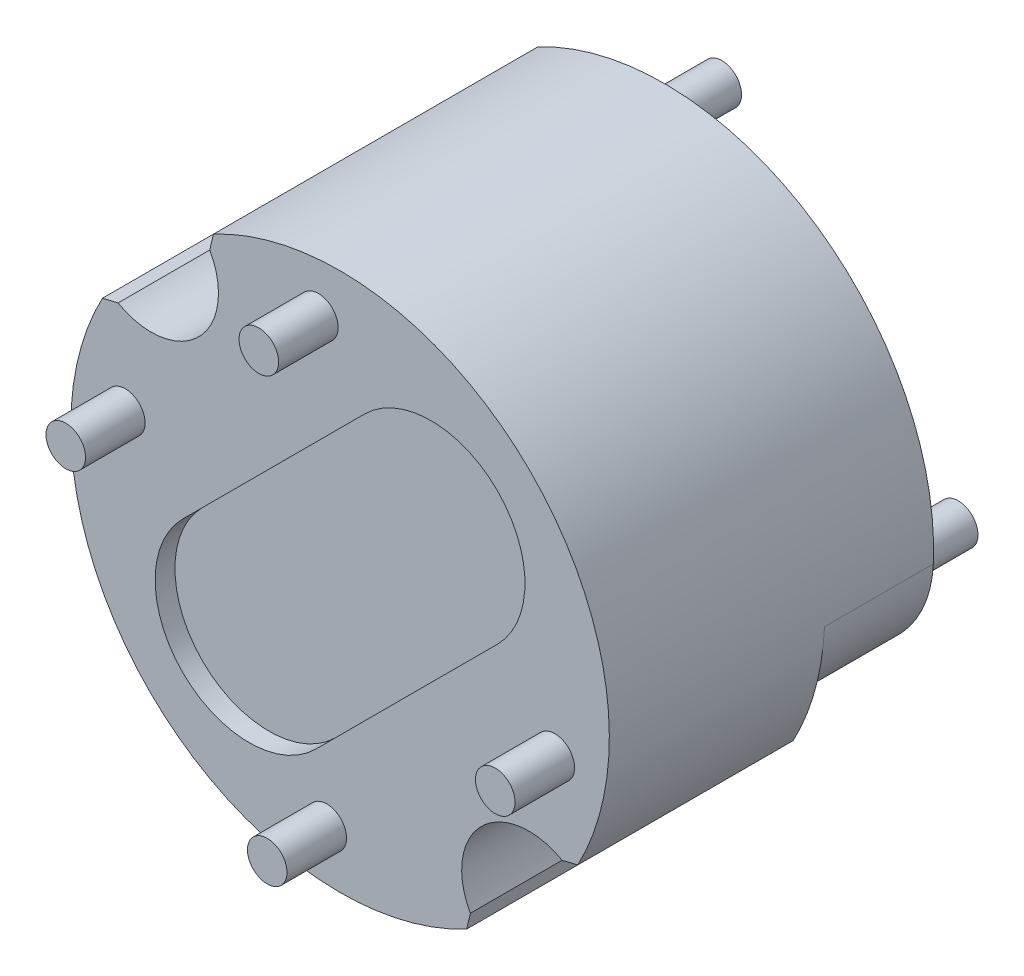
ISO-10303-21;
HEADER;
FILE_DESCRIPTION(('STEP AP214'),'2;1');
FILE_NAME('part.step','',(''),(''),'','','');
FILE_SCHEMA(('AUTOMOTIVE_DESIGN { 1 0 10303 214 1 1 1 1 }'));
ENDSEC;
DATA;
#1=APPLICATION_CONTEXT('core data for automotive mechanical design processes');
#2=APPLICATION_PROTOCOL_DEFINITION('international standard','automotive_design',2000,#1);
#3=PRODUCT_CONTEXT('',#1,'mechanical');
#4=PRODUCT('Part','Part','',(#3));
#5=PRODUCT_RELATED_PRODUCT_CATEGORY('part','',(#4));
#6=PRODUCT_DEFINITION_FORMATION('','',#4);
#7=PRODUCT_DEFINITION_CONTEXT('part definition',#1,'design');
#8=PRODUCT_DEFINITION('design','',#6,#7);
#9=PRODUCT_DEFINITION_SHAPE('','',#8);
#10=(LENGTH_UNIT() NAMED_UNIT(*) SI_UNIT(.MILLI.,.METRE.));
#11=(NAMED_UNIT(*) PLANE_ANGLE_UNIT() SI_UNIT($,.RADIAN.));
#12=(NAMED_UNIT(*) SI_UNIT($,.STERADIAN.) SOLID_ANGLE_UNIT());
#13=UNCERTAINTY_MEASURE_WITH_UNIT(LENGTH_MEASURE(1.E-05),#10,'distance_accuracy_value','');
#14=(GEOMETRIC_REPRESENTATION_CONTEXT(3) GLOBAL_UNCERTAINTY_ASSIGNED_CONTEXT((#13)) GLOBAL_UNIT_ASSIGNED_CONTEXT((#10,
#11,#12)) REPRESENTATION_CONTEXT('',''));
#15=CARTESIAN_POINT('',(0.,0.,0.));
#16=DIRECTION('',(0.,0.,1.));
#17=DIRECTION('',(1.,0.,0.));
#18=AXIS2_PLACEMENT_3D('',#15,#16,#17);
#19=CARTESIAN_POINT('',(10.8540890912135,-2.22738636073771,1245.3));
#20=DIRECTION('',(0.,0.,1.));
#21=DIRECTION('',(1.,0.,0.));
#22=AXIS2_PLACEMENT_3D('',#19,#20,#21);
#23=PLANE('',#22);
#24=CARTESIAN_POINT('',(10.8540890912135,-2.22738636073771,1245.3));
#25=DIRECTION('',(0.,0.,1.));
#26=DIRECTION('',(-0.70710678118655,-0.707106781186545,0.));
#27=AXIS2_PLACEMENT_3D('',#24,#25,#26);
#28=CIRCLE('',#27,1.);
#29=CARTESIAN_POINT('',(10.1469823100269,-2.93449314192425,1245.3));
#30=VERTEX_POINT('',#29);
#31=EDGE_CURVE('E10',#30,#30,#28,.T.);
#32=ORIENTED_EDGE('',*,*,#31,.F.);
#33=EDGE_LOOP('',(#32));
#34=FACE_BOUND('',#33,.T.);
#35=ADVANCED_FACE('F15',(#34),#23,.F.);
#36=CARTESIAN_POINT('',(10.8540890912135,-2.22738636073771,1245.3));
#37=DIRECTION('',(0.,0.,1.));
#38=DIRECTION('',(1.,0.,0.));
#39=AXIS2_PLACEMENT_3D('',#36,#37,#38);
#40=CYLINDRICAL_SURFACE('',#39,1.);
#41=CARTESIAN_POINT('',(10.8540890912135,-2.22738636073771,1249.3));
#42=DIRECTION('',(0.,0.,1.));
#43=DIRECTION('',(-0.70710678118655,-0.707106781186545,0.));
#44=AXIS2_PLACEMENT_3D('',#41,#42,#43);
#45=CIRCLE('',#44,1.);
#46=CARTESIAN_POINT('',(10.1469823100269,-2.93449314192425,1249.3));
#47=VERTEX_POINT('',#46);
#48=EDGE_CURVE('E435',#47,#47,#45,.T.);
#49=ORIENTED_EDGE('',*,*,#48,.F.);
#50=EDGE_LOOP('',(#49));
#51=FACE_BOUND('',#50,.T.);
#52=ORIENTED_EDGE('',*,*,#31,.T.);
#53=EDGE_LOOP('',(#52));
#54=FACE_BOUND('',#53,.T.);
#55=ADVANCED_FACE('F528',(#51,#54),#40,.T.);
#56=CARTESIAN_POINT('',(-1.0960155108391,11.0662211255695,1245.3));
#57=DIRECTION('',(0.,0.,1.));
#58=DIRECTION('',(1.,0.,0.));
#59=AXIS2_PLACEMENT_3D('',#56,#57,#58);
#60=PLANE('',#59);
#61=CARTESIAN_POINT('',(-1.0960155108391,11.0662211255695,1245.3));
#62=DIRECTION('',(0.,0.,1.));
#63=DIRECTION('',(-0.70710678118655,-0.707106781186545,0.));
#64=AXIS2_PLACEMENT_3D('',#61,#62,#63);
#65=CIRCLE('',#64,1.);
#66=CARTESIAN_POINT('',(-1.80312229202565,10.3591143443829,1245.3));
#67=VERTEX_POINT('',#66);
#68=EDGE_CURVE('E26',#67,#67,#65,.T.);
#69=ORIENTED_EDGE('',*,*,#68,.F.);
#70=EDGE_LOOP('',(#69));
#71=FACE_BOUND('',#70,.T.);
#72=ADVANCED_FACE('F535',(#71),#60,.F.);
#73=CARTESIAN_POINT('',(-1.0960155108391,11.0662211255695,1245.3));
#74=DIRECTION('',(0.,0.,1.));
#75=DIRECTION('',(1.,0.,0.));
#76=AXIS2_PLACEMENT_3D('',#73,#74,#75);
#77=CYLINDRICAL_SURFACE('',#76,1.);
#78=CARTESIAN_POINT('',(-1.0960155108391,11.0662211255695,1249.3));
#79=DIRECTION('',(0.,0.,1.));
#80=DIRECTION('',(-0.70710678118655,-0.707106781186545,0.));
#81=AXIS2_PLACEMENT_3D('',#78,#79,#80);
#82=CIRCLE('',#81,1.);
#83=CARTESIAN_POINT('',(-1.80312229202565,10.3591143443829,1249.3));
#84=VERTEX_POINT('',#83);
#85=EDGE_CURVE('E283',#84,#84,#82,.T.);
#86=ORIENTED_EDGE('',*,*,#85,.F.);
#87=EDGE_LOOP('',(#86));
#88=FACE_BOUND('',#87,.T.);
#89=ORIENTED_EDGE('',*,*,#68,.T.);
#90=EDGE_LOOP('',(#89));
#91=FACE_BOUND('',#90,.T.);
#92=ADVANCED_FACE('F581',(#88,#91),#77,.T.);
#93=CARTESIAN_POINT('',(-10.8540890912135,2.01525432638168,1245.3));
#94=DIRECTION('',(0.,0.,-1.));
#95=DIRECTION('',(0.,-1.,0.));
#96=AXIS2_PLACEMENT_3D('',#93,#94,#95);
#97=PLANE('',#96);
#98=CARTESIAN_POINT('',(-10.8540890912135,2.01525432638168,1245.3));
#99=DIRECTION('',(0.,0.,-1.));
#100=DIRECTION('',(-0.70710678118655,-0.707106781186545,0.));
#101=AXIS2_PLACEMENT_3D('',#98,#99,#100);
#102=CIRCLE('',#101,1.);
#103=CARTESIAN_POINT('',(-11.5611958724,1.30814754519513,1245.3));
#104=VERTEX_POINT('',#103);
#105=EDGE_CURVE('E326',#104,#104,#102,.T.);
#106=ORIENTED_EDGE('',*,*,#105,.T.);
#107=EDGE_LOOP('',(#106));
#108=FACE_BOUND('',#107,.T.);
#109=ADVANCED_FACE('F566',(#108),#97,.T.);
#110=CARTESIAN_POINT('',(-10.8540890912135,2.01525432638168,1245.3));
#111=DIRECTION('',(0.,0.,1.));
#112=DIRECTION('',(1.,0.,0.));
#113=AXIS2_PLACEMENT_3D('',#110,#111,#112);
#114=CYLINDRICAL_SURFACE('',#113,1.);
#115=CARTESIAN_POINT('',(-10.8540890912135,2.01525432638168,1249.3));
#116=DIRECTION('',(0.,0.,-1.));
#117=DIRECTION('',(-0.70710678118655,-0.707106781186545,0.));
#118=AXIS2_PLACEMENT_3D('',#115,#116,#117);
#119=CIRCLE('',#118,1.);
#120=CARTESIAN_POINT('',(-11.5611958724,1.30814754519513,1249.3));
#121=VERTEX_POINT('',#120);
#122=EDGE_CURVE('E279',#121,#121,#119,.T.);
#123=ORIENTED_EDGE('',*,*,#122,.T.);
#124=EDGE_LOOP('',(#123));
#125=FACE_BOUND('',#124,.T.);
#126=ORIENTED_EDGE('',*,*,#105,.F.);
#127=EDGE_LOOP('',(#126));
#128=FACE_BOUND('',#127,.T.);
#129=ADVANCED_FACE('F543',(#125,#128),#114,.T.);
#130=CARTESIAN_POINT('',(-0.671751442127275,-11.0662211255695,1245.3));
#131=DIRECTION('',(0.,0.,1.));
#132=DIRECTION('',(1.,0.,0.));
#133=AXIS2_PLACEMENT_3D('',#130,#131,#132);
#134=PLANE('',#133);
#135=CARTESIAN_POINT('',(-0.671751442127275,-11.0662211255695,1245.3));
#136=DIRECTION('',(0.,0.,1.));
#137=DIRECTION('',(-0.70710678118655,-0.707106781186545,0.));
#138=AXIS2_PLACEMENT_3D('',#135,#136,#137);
#139=CIRCLE('',#138,1.);
#140=CARTESIAN_POINT('',(-1.37885822331383,-11.773327906756,1245.3));
#141=VERTEX_POINT('',#140);
#142=EDGE_CURVE('E287',#141,#141,#139,.T.);
#143=ORIENTED_EDGE('',*,*,#142,.F.);
#144=EDGE_LOOP('',(#143));
#145=FACE_BOUND('',#144,.T.);
#146=ADVANCED_FACE('F539',(#145),#134,.F.);
#147=CARTESIAN_POINT('',(-0.671751442127275,-11.0662211255695,1245.3));
#148=DIRECTION('',(0.,0.,1.));
#149=DIRECTION('',(1.,0.,0.));
#150=AXIS2_PLACEMENT_3D('',#147,#148,#149);
#151=CYLINDRICAL_SURFACE('',#150,1.);
#152=CARTESIAN_POINT('',(-0.671751442127275,-11.0662211255695,1249.3));
#153=DIRECTION('',(0.,0.,1.));
#154=DIRECTION('',(-0.70710678118655,-0.707106781186545,0.));
#155=AXIS2_PLACEMENT_3D('',#152,#153,#154);
#156=CIRCLE('',#155,1.);
#157=CARTESIAN_POINT('',(-1.37885822331383,-11.773327906756,1249.3));
#158=VERTEX_POINT('',#157);
#159=EDGE_CURVE('E282',#158,#158,#156,.T.);
#160=ORIENTED_EDGE('',*,*,#159,.F.);
#161=EDGE_LOOP('',(#160));
#162=FACE_BOUND('',#161,.T.);
#163=ORIENTED_EDGE('',*,*,#142,.T.);
#164=EDGE_LOOP('',(#163));
#165=FACE_BOUND('',#164,.T.);
#166=ADVANCED_FACE('F542',(#162,#165),#151,.T.);
#167=CARTESIAN_POINT('',(-10.8540890912135,2.01525432638168,1251.4));
#168=DIRECTION('',(0.,0.,-1.));
#169=DIRECTION('',(0.869471571579577,0.493982981705787,0.));
#170=AXIS2_PLACEMENT_3D('',#167,#168,#169);
#171=CYLINDRICAL_SURFACE('',#170,1.);
#172=CARTESIAN_POINT('',(-10.8540890912135,2.01525432638168,1265.69));
#173=DIRECTION('',(0.,0.,1.));
#174=DIRECTION('',(-0.707106781186551,-0.707106781186545,0.));
#175=AXIS2_PLACEMENT_3D('',#172,#173,#174);
#176=CIRCLE('',#175,1.);
#177=CARTESIAN_POINT('',(-11.5611958724001,1.30814754519513,1265.69));
#178=VERTEX_POINT('',#177);
#179=EDGE_CURVE('E234',#178,#178,#176,.T.);
#180=ORIENTED_EDGE('',*,*,#179,.T.);
#181=EDGE_LOOP('',(#180));
#182=FACE_BOUND('',#181,.T.);
#183=CARTESIAN_POINT('',(-10.8540890912135,2.01525432638168,1268.7));
#184=DIRECTION('',(0.,0.,1.));
#185=DIRECTION('',(-0.707106781186551,-0.707106781186545,0.));
#186=AXIS2_PLACEMENT_3D('',#183,#184,#185);
#187=CIRCLE('',#186,1.);
#188=CARTESIAN_POINT('',(-11.5611958724001,1.30814754519513,1268.7));
#189=VERTEX_POINT('',#188);
#190=EDGE_CURVE('E338',#189,#189,#187,.T.);
#191=ORIENTED_EDGE('',*,*,#190,.F.);
#192=EDGE_LOOP('',(#191));
#193=FACE_BOUND('',#192,.T.);
#194=ADVANCED_FACE('F568',(#182,#193),#171,.T.);
#195=CARTESIAN_POINT('',(-1.0960155108391,11.0662211255694,1251.4));
#196=DIRECTION('',(0.,0.,-1.));
#197=DIRECTION('',(-0.410279257596146,0.911959939244238,0.));
#198=AXIS2_PLACEMENT_3D('',#195,#196,#197);
#199=CYLINDRICAL_SURFACE('',#198,1.);
#200=CARTESIAN_POINT('',(-1.0960155108391,11.0662211255694,1265.69));
#201=DIRECTION('',(0.,0.,1.));
#202=DIRECTION('',(-0.707106781186551,-0.707106781186545,0.));
#203=AXIS2_PLACEMENT_3D('',#200,#201,#202);
#204=CIRCLE('',#203,1.);
#205=CARTESIAN_POINT('',(-1.80312229202565,10.3591143443829,1265.69));
#206=VERTEX_POINT('',#205);
#207=EDGE_CURVE('E228',#206,#206,#204,.T.);
#208=ORIENTED_EDGE('',*,*,#207,.T.);
#209=EDGE_LOOP('',(#208));
#210=FACE_BOUND('',#209,.T.);
#211=CARTESIAN_POINT('',(-1.0960155108391,11.0662211255694,1268.7));
#212=DIRECTION('',(0.,0.,1.));
#213=DIRECTION('',(0.707106781186545,-0.707106781186551,0.));
#214=AXIS2_PLACEMENT_3D('',#211,#212,#213);
#215=CIRCLE('',#214,1.);
#216=CARTESIAN_POINT('',(-0.388908729652555,10.3591143443829,1268.7));
#217=VERTEX_POINT('',#216);
#218=EDGE_CURVE('E439',#217,#217,#215,.T.);
#219=ORIENTED_EDGE('',*,*,#218,.F.);
#220=EDGE_LOOP('',(#219));
#221=FACE_BOUND('',#220,.T.);
#222=ADVANCED_FACE('F229',(#210,#221),#199,.T.);
#223=CARTESIAN_POINT('',(10.8540890912135,-2.22738636073771,1251.4));
#224=DIRECTION('',(0.,0.,-1.));
#225=DIRECTION('',(-0.707106781186545,0.707106781186551,0.));
#226=AXIS2_PLACEMENT_3D('',#223,#224,#225);
#227=CYLINDRICAL_SURFACE('',#226,1.);
#228=CARTESIAN_POINT('',(10.8540890912135,-2.22738636073771,1265.69));
#229=DIRECTION('',(0.,0.,1.));
#230=DIRECTION('',(-0.707106781186551,-0.707106781186545,0.));
#231=AXIS2_PLACEMENT_3D('',#228,#229,#230);
#232=CIRCLE('',#231,1.);
#233=CARTESIAN_POINT('',(10.1469823100269,-2.93449314192425,1265.69));
#234=VERTEX_POINT('',#233);
#235=EDGE_CURVE('E233',#234,#234,#232,.T.);
#236=ORIENTED_EDGE('',*,*,#235,.T.);
#237=EDGE_LOOP('',(#236));
#238=FACE_BOUND('',#237,.T.);
#239=CARTESIAN_POINT('',(10.8540890912135,-2.22738636073771,1268.7));
#240=DIRECTION('',(0.,0.,1.));
#241=DIRECTION('',(0.707106781186545,-0.707106781186551,0.));
#242=AXIS2_PLACEMENT_3D('',#239,#240,#241);
#243=CIRCLE('',#242,1.);
#244=CARTESIAN_POINT('',(11.5611958724,-2.93449314192426,1268.7));
#245=VERTEX_POINT('',#244);
#246=EDGE_CURVE('E263',#245,#245,#243,.T.);
#247=ORIENTED_EDGE('',*,*,#246,.F.);
#248=EDGE_LOOP('',(#247));
#249=FACE_BOUND('',#248,.T.);
#250=ADVANCED_FACE('F617',(#238,#249),#227,.T.);
#251=CARTESIAN_POINT('',(-0.671751442127273,-11.0662211255695,1251.4));
#252=DIRECTION('',(0.,0.,-1.));
#253=DIRECTION('',(-0.707106781186545,0.707106781186551,0.));
#254=AXIS2_PLACEMENT_3D('',#251,#252,#253);
#255=CYLINDRICAL_SURFACE('',#254,1.);
#256=CARTESIAN_POINT('',(-0.671751442127273,-11.0662211255695,1265.69));
#257=DIRECTION('',(0.,0.,1.));
#258=DIRECTION('',(-0.707106781186551,-0.707106781186545,0.));
#259=AXIS2_PLACEMENT_3D('',#256,#257,#258);
#260=CIRCLE('',#259,1.);
#261=CARTESIAN_POINT('',(-1.37885822331382,-11.773327906756,1265.69));
#262=VERTEX_POINT('',#261);
#263=EDGE_CURVE('E241',#262,#262,#260,.T.);
#264=ORIENTED_EDGE('',*,*,#263,.T.);
#265=EDGE_LOOP('',(#264));
#266=FACE_BOUND('',#265,.T.);
#267=CARTESIAN_POINT('',(-0.671751442127273,-11.0662211255695,1268.7));
#268=DIRECTION('',(0.,0.,1.));
#269=DIRECTION('',(0.707106781186545,-0.707106781186551,0.));
#270=AXIS2_PLACEMENT_3D('',#267,#268,#269);
#271=CIRCLE('',#270,1.);
#272=CARTESIAN_POINT('',(0.035355339059271,-11.7733279067561,1268.7));
#273=VERTEX_POINT('',#272);
#274=EDGE_CURVE('E291',#273,#273,#271,.T.);
#275=ORIENTED_EDGE('',*,*,#274,.F.);
#276=EDGE_LOOP('',(#275));
#277=FACE_BOUND('',#276,.T.);
#278=ADVANCED_FACE('F555',(#266,#277),#255,.T.);
#279=CARTESIAN_POINT('',(7.60198636467326,-0.349146547057058,1248.75));
#280=DIRECTION('',(0.,0.,1.));
#281=DIRECTION('',(-0.707106781186551,-0.707106781186544,0.));
#282=AXIS2_PLACEMENT_3D('',#279,#280,#281);
#283=CYLINDRICAL_SURFACE('',#282,6.);
#284=DIRECTION('',(0.,0.,1.));
#285=VECTOR('',#284,1.);
#286=CARTESIAN_POINT('',(13.5956681239426,-0.624426347627646,1248.75));
#287=LINE('',#286,#285);
#288=CARTESIAN_POINT('',(13.5956681239426,-0.624426347627646,1249.3));
#289=VERTEX_POINT('',#288);
#290=CARTESIAN_POINT('',(13.5956681239426,-0.624426347627646,1254.8));
#291=VERTEX_POINT('',#290);
#292=EDGE_CURVE('E376',#289,#291,#287,.T.);
#293=ORIENTED_EDGE('',*,*,#292,.T.);
#294=CARTESIAN_POINT('',(7.60198636467326,-0.349146547057058,1254.8));
#295=DIRECTION('',(0.,0.,-1.));
#296=DIRECTION('',(0.707106781186551,0.707106781186544,0.));
#297=AXIS2_PLACEMENT_3D('',#294,#295,#296);
#298=CIRCLE('',#297,6.);
#299=CARTESIAN_POINT('',(8.84280882085097,-6.21944122724519,1254.8));
#300=VERTEX_POINT('',#299);
#301=EDGE_CURVE('E258',#291,#300,#298,.T.);
#302=ORIENTED_EDGE('',*,*,#301,.T.);
#303=DIRECTION('',(0.,0.,1.));
#304=VECTOR('',#303,1.);
#305=CARTESIAN_POINT('',(8.84280882085097,-6.21944122724519,1248.75));
#306=LINE('',#305,#304);
#307=CARTESIAN_POINT('',(8.84280882085097,-6.21944122724519,1249.3));
#308=VERTEX_POINT('',#307);
#309=EDGE_CURVE('E278',#308,#300,#306,.T.);
#310=ORIENTED_EDGE('',*,*,#309,.F.);
#311=CARTESIAN_POINT('',(7.60198636467326,-0.349146547057058,1249.3));
#312=DIRECTION('',(0.,0.,-1.));
#313=DIRECTION('',(-0.707106781186551,-0.707106781186544,0.));
#314=AXIS2_PLACEMENT_3D('',#311,#312,#313);
#315=CIRCLE('',#314,6.);
#316=EDGE_CURVE('E288',#289,#308,#315,.T.);
#317=ORIENTED_EDGE('',*,*,#316,.F.);
#318=EDGE_LOOP('',(#293,#302,#310,#317));
#319=FACE_BOUND('',#318,.T.);
#320=ADVANCED_FACE('F552',(#319),#283,.T.);
#321=CARTESIAN_POINT('',(0.34914654705696,-7.60198636467329,1248.75));
#322=DIRECTION('',(0.,0.,1.));
#323=DIRECTION('',(-0.707106781186551,-0.707106781186544,0.));
#324=AXIS2_PLACEMENT_3D('',#321,#322,#323);
#325=CYLINDRICAL_SURFACE('',#324,6.);
#326=DIRECTION('',(0.,0.,1.));
#327=VECTOR('',#326,1.);
#328=CARTESIAN_POINT('',(6.21944122724507,-8.84280882085106,1248.75));
#329=LINE('',#328,#327);
#330=CARTESIAN_POINT('',(6.21944122724507,-8.84280882085106,1249.3));
#331=VERTEX_POINT('',#330);
#332=CARTESIAN_POINT('',(6.21944122724507,-8.84280882085106,1254.8));
#333=VERTEX_POINT('',#332);
#334=EDGE_CURVE('E257',#331,#333,#329,.T.);
#335=ORIENTED_EDGE('',*,*,#334,.T.);
#336=CARTESIAN_POINT('',(0.34914654705696,-7.60198636467329,1254.8));
#337=DIRECTION('',(0.,0.,-1.));
#338=DIRECTION('',(0.707106781186551,0.707106781186544,0.));
#339=AXIS2_PLACEMENT_3D('',#336,#337,#338);
#340=CIRCLE('',#339,6.);
#341=CARTESIAN_POINT('',(0.624426347627487,-13.5956681239426,1254.8));
#342=VERTEX_POINT('',#341);
#343=EDGE_CURVE('E301',#333,#342,#340,.T.);
#344=ORIENTED_EDGE('',*,*,#343,.T.);
#345=DIRECTION('',(0.,0.,1.));
#346=VECTOR('',#345,1.);
#347=CARTESIAN_POINT('',(0.624426347627487,-13.5956681239426,1248.75));
#348=LINE('',#347,#346);
#349=CARTESIAN_POINT('',(0.624426347627487,-13.5956681239426,1249.3));
#350=VERTEX_POINT('',#349);
#351=EDGE_CURVE('E317',#350,#342,#348,.T.);
#352=ORIENTED_EDGE('',*,*,#351,.F.);
#353=CARTESIAN_POINT('',(0.34914654705696,-7.60198636467329,1249.3));
#354=DIRECTION('',(0.,0.,-1.));
#355=DIRECTION('',(-0.707106781186551,-0.707106781186544,0.));
#356=AXIS2_PLACEMENT_3D('',#353,#354,#355);
#357=CIRCLE('',#356,6.);
#358=EDGE_CURVE('E284',#331,#350,#357,.T.);
#359=ORIENTED_EDGE('',*,*,#358,.F.);
#360=EDGE_LOOP('',(#335,#344,#352,#359));
#361=FACE_BOUND('',#360,.T.);
#362=ADVANCED_FACE('F551',(#361),#325,.T.);
#363=CARTESIAN_POINT('',(0.,0.,1249.3));
#364=DIRECTION('',(0.,0.,1.));
#365=DIRECTION('',(1.,0.,0.));
#366=AXIS2_PLACEMENT_3D('',#363,#364,#365);
#367=PLANE('',#366);
#368=CARTESIAN_POINT('',(0.,0.,1249.3));
#369=DIRECTION('',(0.,0.,1.));
#370=DIRECTION('',(0.707106781186551,0.707106781186544,0.));
#371=AXIS2_PLACEMENT_3D('',#368,#369,#370);
#372=CIRCLE('',#371,13.61);
#373=CARTESIAN_POINT('',(-6.3979802645824,12.0124081072037,1249.3));
#374=VERTEX_POINT('',#373);
#375=EDGE_CURVE('E19',#289,#374,#372,.T.);
#376=ORIENTED_EDGE('',*,*,#375,.F.);
#377=ORIENTED_EDGE('',*,*,#316,.T.);
#378=CARTESIAN_POINT('',(9.54594154601835,-9.54594154601847,1249.3));
#379=DIRECTION('',(0.,0.,-1.));
#380=DIRECTION('',(0.707106781186551,0.707106781186544,0.));
#381=AXIS2_PLACEMENT_3D('',#378,#379,#380);
#382=CIRCLE('',#381,3.4);
#383=EDGE_CURVE('E346',#331,#308,#382,.T.);
#384=ORIENTED_EDGE('',*,*,#383,.F.);
#385=ORIENTED_EDGE('',*,*,#358,.T.);
#386=CARTESIAN_POINT('',(0.,0.,1249.3));
#387=DIRECTION('',(0.,0.,1.));
#388=DIRECTION('',(0.707106781186551,0.707106781186544,0.));
#389=AXIS2_PLACEMENT_3D('',#386,#387,#388);
#390=CIRCLE('',#389,13.61);
#391=CARTESIAN_POINT('',(-12.0124081072036,6.39798026458251,1249.3));
#392=VERTEX_POINT('',#391);
#393=EDGE_CURVE('E421',#392,#350,#390,.T.);
#394=ORIENTED_EDGE('',*,*,#393,.F.);
#395=DIRECTION('',(-0.972492018808413,-0.232936200179228,0.));
#396=VECTOR('',#395,1.);
#397=CARTESIAN_POINT('',(-11.2214306528845,6.58743917948683,1249.3));
#398=LINE('',#397,#396);
#399=CARTESIAN_POINT('',(-11.221430652881,6.58743917948484,1249.3));
#400=VERTEX_POINT('',#399);
#401=EDGE_CURVE('E318',#400,#392,#398,.T.);
#402=ORIENTED_EDGE('',*,*,#401,.F.);
#403=CARTESIAN_POINT('',(-9.54594154601835,9.5459415460184,1249.3));
#404=DIRECTION('',(0.,0.,-1.));
#405=DIRECTION('',(0.707106781186551,0.707106781186544,0.));
#406=AXIS2_PLACEMENT_3D('',#403,#404,#405);
#407=CIRCLE('',#406,3.4);
#408=CARTESIAN_POINT('',(-6.58743917948676,11.2214306528845,1249.3));
#409=VERTEX_POINT('',#408);
#410=EDGE_CURVE('E352',#409,#400,#407,.T.);
#411=ORIENTED_EDGE('',*,*,#410,.F.);
#412=DIRECTION('',(-0.232936200179237,-0.972492018808411,0.));
#413=VECTOR('',#412,1.);
#414=CARTESIAN_POINT('',(-6.39798026458244,12.0124081072037,1249.3));
#415=LINE('',#414,#413);
#416=EDGE_CURVE('E310',#374,#409,#415,.T.);
#417=ORIENTED_EDGE('',*,*,#416,.F.);
#418=EDGE_LOOP('',(#376,#377,#384,#385,#394,#402,#411,#417));
#419=FACE_BOUND('',#418,.T.);
#420=ORIENTED_EDGE('',*,*,#159,.T.);
#421=EDGE_LOOP('',(#420));
#422=FACE_BOUND('',#421,.T.);
#423=ORIENTED_EDGE('',*,*,#122,.F.);
#424=EDGE_LOOP('',(#423));
#425=FACE_BOUND('',#424,.T.);
#426=ORIENTED_EDGE('',*,*,#85,.T.);
#427=EDGE_LOOP('',(#426));
#428=FACE_BOUND('',#427,.T.);
#429=ORIENTED_EDGE('',*,*,#48,.T.);
#430=EDGE_LOOP('',(#429));
#431=FACE_BOUND('',#430,.T.);
#432=ADVANCED_FACE('F394',(#419,#422,#425,#428,#431),#367,.F.);
#433=CARTESIAN_POINT('',(1.23743686707649,7.95495128834862,1264.69));
#434=DIRECTION('',(-0.707106781186545,0.707106781186551,0.));
#435=DIRECTION('',(0.,0.,1.));
#436=AXIS2_PLACEMENT_3D('',#433,#434,#435);
#437=PLANE('',#436);
#438=DIRECTION('',(-0.707106781186551,-0.707106781186545,0.));
#439=VECTOR('',#438,1.);
#440=CARTESIAN_POINT('',(1.23743686707649,7.95495128834862,1265.69));
#441=LINE('',#440,#439);
#442=CARTESIAN_POINT('',(1.23743686707649,7.95495128834862,1265.69));
#443=VERTEX_POINT('',#442);
#444=CARTESIAN_POINT('',(-7.95495128834867,-1.23743686707645,1265.69));
#445=VERTEX_POINT('',#444);
#446=EDGE_CURVE('E272',#443,#445,#441,.T.);
#447=ORIENTED_EDGE('',*,*,#446,.T.);
#448=DIRECTION('',(0.,0.,1.));
#449=VECTOR('',#448,1.);
#450=CARTESIAN_POINT('',(-7.95495128834867,-1.23743686707645,1264.69));
#451=LINE('',#450,#449);
#452=CARTESIAN_POINT('',(-7.95495128834867,-1.23743686707645,1264.69));
#453=VERTEX_POINT('',#452);
#454=EDGE_CURVE('E277',#453,#445,#451,.T.);
#455=ORIENTED_EDGE('',*,*,#454,.F.);
#456=DIRECTION('',(-0.707106781186551,-0.707106781186545,0.));
#457=VECTOR('',#456,1.);
#458=CARTESIAN_POINT('',(1.23743686707649,7.95495128834862,1264.69));
#459=LINE('',#458,#457);
#460=CARTESIAN_POINT('',(1.23743686707649,7.95495128834862,1264.69));
#461=VERTEX_POINT('',#460);
#462=EDGE_CURVE('E253',#461,#453,#459,.T.);
#463=ORIENTED_EDGE('',*,*,#462,.F.);
#464=DIRECTION('',(0.,0.,1.));
#465=VECTOR('',#464,1.);
#466=CARTESIAN_POINT('',(1.23743686707649,7.95495128834862,1264.69));
#467=LINE('',#466,#465);
#468=EDGE_CURVE('E295',#461,#443,#467,.T.);
#469=ORIENTED_EDGE('',*,*,#468,.T.);
#470=EDGE_LOOP('',(#447,#455,#463,#469));
#471=FACE_BOUND('',#470,.T.);
#472=ADVANCED_FACE('F550',(#471),#437,.F.);
#473=CARTESIAN_POINT('',(4.59619407771258,4.5961940777125,1264.69));
#474=DIRECTION('',(0.,0.,1.));
#475=DIRECTION('',(-0.707106781186551,-0.707106781186544,0.));
#476=AXIS2_PLACEMENT_3D('',#473,#474,#475);
#477=CYLINDRICAL_SURFACE('',#476,4.75);
#478=CARTESIAN_POINT('',(4.59619407771258,4.5961940777125,1265.69));
#479=DIRECTION('',(0.,0.,1.));
#480=DIRECTION('',(0.707106781186551,0.707106781186544,0.));
#481=AXIS2_PLACEMENT_3D('',#478,#479,#480);
#482=CIRCLE('',#481,4.75);
#483=CARTESIAN_POINT('',(7.95495128834866,1.23743686707639,1265.69));
#484=VERTEX_POINT('',#483);
#485=EDGE_CURVE('E343',#484,#443,#482,.T.);
#486=ORIENTED_EDGE('',*,*,#485,.T.);
#487=ORIENTED_EDGE('',*,*,#468,.F.);
#488=CARTESIAN_POINT('',(4.59619407771258,4.5961940777125,1264.69));
#489=DIRECTION('',(0.,0.,1.));
#490=DIRECTION('',(0.707106781186551,0.707106781186544,0.));
#491=AXIS2_PLACEMENT_3D('',#488,#489,#490);
#492=CIRCLE('',#491,4.75);
#493=CARTESIAN_POINT('',(7.95495128834866,1.23743686707639,1264.69));
#494=VERTEX_POINT('',#493);
#495=EDGE_CURVE('E243',#494,#461,#492,.T.);
#496=ORIENTED_EDGE('',*,*,#495,.F.);
#497=DIRECTION('',(0.,0.,1.));
#498=VECTOR('',#497,1.);
#499=CARTESIAN_POINT('',(7.95495128834866,1.23743686707639,1264.69));
#500=LINE('',#499,#498);
#501=EDGE_CURVE('E292',#494,#484,#500,.T.);
#502=ORIENTED_EDGE('',*,*,#501,.T.);
#503=EDGE_LOOP('',(#486,#487,#496,#502));
#504=FACE_BOUND('',#503,.T.);
#505=ADVANCED_FACE('F563',(#504),#477,.F.);
#506=CARTESIAN_POINT('',(-1.2374368670765,-7.95495128834869,1264.69));
#507=DIRECTION('',(0.707106781186544,-0.707106781186551,0.));
#508=DIRECTION('',(0.,0.,-1.));
#509=AXIS2_PLACEMENT_3D('',#506,#507,#508);
#510=PLANE('',#509);
#511=DIRECTION('',(0.707106781186551,0.707106781186544,0.));
#512=VECTOR('',#511,1.);
#513=CARTESIAN_POINT('',(-1.2374368670765,-7.95495128834869,1265.69));
#514=LINE('',#513,#512);
#515=CARTESIAN_POINT('',(-1.2374368670765,-7.95495128834869,1265.69));
#516=VERTEX_POINT('',#515);
#517=EDGE_CURVE('E339',#516,#484,#514,.T.);
#518=ORIENTED_EDGE('',*,*,#517,.T.);
#519=ORIENTED_EDGE('',*,*,#501,.F.);
#520=DIRECTION('',(0.707106781186551,0.707106781186544,0.));
#521=VECTOR('',#520,1.);
#522=CARTESIAN_POINT('',(-1.2374368670765,-7.95495128834869,1264.69));
#523=LINE('',#522,#521);
#524=CARTESIAN_POINT('',(-1.2374368670765,-7.95495128834869,1264.69));
#525=VERTEX_POINT('',#524);
#526=EDGE_CURVE('E252',#525,#494,#523,.T.);
#527=ORIENTED_EDGE('',*,*,#526,.F.);
#528=DIRECTION('',(0.,0.,1.));
#529=VECTOR('',#528,1.);
#530=CARTESIAN_POINT('',(-1.2374368670765,-7.95495128834869,1264.69));
#531=LINE('',#530,#529);
#532=EDGE_CURVE('E274',#525,#516,#531,.T.);
#533=ORIENTED_EDGE('',*,*,#532,.T.);
#534=EDGE_LOOP('',(#518,#519,#527,#533));
#535=FACE_BOUND('',#534,.T.);
#536=ADVANCED_FACE('F613',(#535),#510,.F.);
#537=CARTESIAN_POINT('',(-4.59619407771258,-4.59619407771257,1264.69));
#538=DIRECTION('',(0.,0.,1.));
#539=DIRECTION('',(-0.707106781186551,-0.707106781186544,0.));
#540=AXIS2_PLACEMENT_3D('',#537,#538,#539);
#541=CYLINDRICAL_SURFACE('',#540,4.75);
#542=CARTESIAN_POINT('',(-4.59619407771258,-4.59619407771257,1265.69));
#543=DIRECTION('',(0.,0.,1.));
#544=DIRECTION('',(0.707106781186551,0.707106781186544,0.));
#545=AXIS2_PLACEMENT_3D('',#542,#543,#544);
#546=CIRCLE('',#545,4.75);
#547=EDGE_CURVE('E268',#445,#516,#546,.T.);
#548=ORIENTED_EDGE('',*,*,#547,.T.);
#549=ORIENTED_EDGE('',*,*,#532,.F.);
#550=CARTESIAN_POINT('',(-4.59619407771258,-4.59619407771257,1264.69));
#551=DIRECTION('',(0.,0.,1.));
#552=DIRECTION('',(0.707106781186551,0.707106781186544,0.));
#553=AXIS2_PLACEMENT_3D('',#550,#551,#552);
#554=CIRCLE('',#553,4.75);
#555=EDGE_CURVE('E248',#453,#525,#554,.T.);
#556=ORIENTED_EDGE('',*,*,#555,.F.);
#557=ORIENTED_EDGE('',*,*,#454,.T.);
#558=EDGE_LOOP('',(#548,#549,#556,#557));
#559=FACE_BOUND('',#558,.T.);
#560=ADVANCED_FACE('F588',(#559),#541,.F.);
#561=CARTESIAN_POINT('',(11.2214306528845,-6.58743917948689,1265.69));
#562=DIRECTION('',(-0.232936200179228,0.972492018808413,0.));
#563=DIRECTION('',(0.,0.,1.));
#564=AXIS2_PLACEMENT_3D('',#561,#562,#563);
#565=PLANE('',#564);
#566=DIRECTION('',(-0.972492018808413,-0.232936200179228,0.));
#567=VECTOR('',#566,1.);
#568=CARTESIAN_POINT('',(2.10111001892178,-8.77198444238228,1254.8));
#569=LINE('',#568,#567);
#570=CARTESIAN_POINT('',(12.0124081072036,-6.39798026458258,1254.8));
#571=VERTEX_POINT('',#570);
#572=CARTESIAN_POINT('',(11.2214306528818,-6.58743917948536,1254.8));
#573=VERTEX_POINT('',#572);
#574=EDGE_CURVE('E305',#571,#573,#569,.T.);
#575=ORIENTED_EDGE('',*,*,#574,.F.);
#576=DIRECTION('',(0.,0.,1.));
#577=VECTOR('',#576,1.);
#578=CARTESIAN_POINT('',(12.0124081072036,-6.39798026458258,1265.69));
#579=LINE('',#578,#577);
#580=CARTESIAN_POINT('',(12.0124081072036,-6.39798026458258,1265.69));
#581=VERTEX_POINT('',#580);
#582=EDGE_CURVE('E267',#571,#581,#579,.T.);
#583=ORIENTED_EDGE('',*,*,#582,.T.);
#584=DIRECTION('',(-0.972492018808413,-0.232936200179228,0.));
#585=VECTOR('',#584,1.);
#586=CARTESIAN_POINT('',(11.2214306528845,-6.58743917948689,1265.69));
#587=LINE('',#586,#585);
#588=CARTESIAN_POINT('',(11.2214306528818,-6.58743917948536,1265.69));
#589=VERTEX_POINT('',#588);
#590=EDGE_CURVE('E273',#581,#589,#587,.T.);
#591=ORIENTED_EDGE('',*,*,#590,.T.);
#592=DIRECTION('',(0.,0.,1.));
#593=VECTOR('',#592,1.);
#594=CARTESIAN_POINT('',(11.2214306528818,-6.58743917948536,1265.69));
#595=LINE('',#594,#593);
#596=EDGE_CURVE('E254',#573,#589,#595,.T.);
#597=ORIENTED_EDGE('',*,*,#596,.F.);
#598=EDGE_LOOP('',(#575,#583,#591,#597));
#599=FACE_BOUND('',#598,.T.);
#600=ADVANCED_FACE('F586',(#599),#565,.F.);
#601=CARTESIAN_POINT('',(9.54594154601835,-9.54594154601847,1265.69));
#602=DIRECTION('',(0.,0.,-1.));
#603=DIRECTION('',(0.707106781186551,0.707106781186544,0.));
#604=AXIS2_PLACEMENT_3D('',#601,#602,#603);
#605=CYLINDRICAL_SURFACE('',#604,3.4);
#606=CARTESIAN_POINT('',(9.54594154601835,-9.54594154601847,1254.8));
#607=DIRECTION('',(0.,0.,1.));
#608=DIRECTION('',(-0.707106781186551,-0.707106781186544,0.));
#609=AXIS2_PLACEMENT_3D('',#606,#607,#608);
#610=CIRCLE('',#609,3.4);
#611=EDGE_CURVE('E309',#573,#300,#610,.T.);
#612=ORIENTED_EDGE('',*,*,#611,.F.);
#613=ORIENTED_EDGE('',*,*,#596,.T.);
#614=CARTESIAN_POINT('',(9.54594154601835,-9.54594154601847,1265.69));
#615=DIRECTION('',(0.,0.,1.));
#616=DIRECTION('',(0.707106781186551,0.707106781186544,0.));
#617=AXIS2_PLACEMENT_3D('',#614,#615,#616);
#618=CIRCLE('',#617,3.4);
#619=CARTESIAN_POINT('',(6.58743917948676,-11.2214306528846,1265.69));
#620=VERTEX_POINT('',#619);
#621=EDGE_CURVE('E335',#589,#620,#618,.T.);
#622=ORIENTED_EDGE('',*,*,#621,.T.);
#623=DIRECTION('',(0.,0.,1.));
#624=VECTOR('',#623,1.);
#625=CARTESIAN_POINT('',(6.58743917948676,-11.2214306528846,1265.69));
#626=LINE('',#625,#624);
#627=CARTESIAN_POINT('',(6.58743917948676,-11.2214306528846,1254.8));
#628=VERTEX_POINT('',#627);
#629=EDGE_CURVE('E81',#628,#620,#626,.T.);
#630=ORIENTED_EDGE('',*,*,#629,.F.);
#631=CARTESIAN_POINT('',(9.54594154601835,-9.54594154601847,1254.8));
#632=DIRECTION('',(0.,0.,1.));
#633=DIRECTION('',(-0.707106781186551,-0.707106781186544,0.));
#634=AXIS2_PLACEMENT_3D('',#631,#632,#633);
#635=CIRCLE('',#634,3.4);
#636=EDGE_CURVE('E296',#333,#628,#635,.T.);
#637=ORIENTED_EDGE('',*,*,#636,.F.);
#638=ORIENTED_EDGE('',*,*,#334,.F.);
#639=ORIENTED_EDGE('',*,*,#383,.T.);
#640=ORIENTED_EDGE('',*,*,#309,.T.);
#641=EDGE_LOOP('',(#612,#613,#622,#630,#637,#638,#639,#640));
#642=FACE_BOUND('',#641,.T.);
#643=ADVANCED_FACE('F523',(#642),#605,.F.);
#644=CARTESIAN_POINT('',(6.39798026458243,-12.0124081072037,1265.69));
#645=DIRECTION('',(-0.972492018808411,0.232936200179237,0.));
#646=DIRECTION('',(0.,0.,1.));
#647=AXIS2_PLACEMENT_3D('',#644,#645,#646);
#648=PLANE('',#647);
#649=DIRECTION('',(-0.232936200179237,-0.972492018808411,0.));
#650=VECTOR('',#649,1.);
#651=CARTESIAN_POINT('',(8.77198444238221,-2.10111001892189,1254.8));
#652=LINE('',#651,#650);
#653=CARTESIAN_POINT('',(6.39798026458243,-12.0124081072037,1254.8));
#654=VERTEX_POINT('',#653);
#655=EDGE_CURVE('E300',#628,#654,#652,.T.);
#656=ORIENTED_EDGE('',*,*,#655,.F.);
#657=ORIENTED_EDGE('',*,*,#629,.T.);
#658=DIRECTION('',(-0.232936200179237,-0.972492018808411,0.));
#659=VECTOR('',#658,1.);
#660=CARTESIAN_POINT('',(6.39798026458243,-12.0124081072037,1265.69));
#661=LINE('',#660,#659);
#662=CARTESIAN_POINT('',(6.39798026458243,-12.0124081072037,1265.69));
#663=VERTEX_POINT('',#662);
#664=EDGE_CURVE('E361',#620,#663,#661,.T.);
#665=ORIENTED_EDGE('',*,*,#664,.T.);
#666=DIRECTION('',(0.,0.,1.));
#667=VECTOR('',#666,1.);
#668=CARTESIAN_POINT('',(6.39798026458243,-12.0124081072037,1265.69));
#669=LINE('',#668,#667);
#670=EDGE_CURVE('E93',#654,#663,#669,.T.);
#671=ORIENTED_EDGE('',*,*,#670,.F.);
#672=EDGE_LOOP('',(#656,#657,#665,#671));
#673=FACE_BOUND('',#672,.T.);
#674=ADVANCED_FACE('F508',(#673),#648,.F.);
#675=CARTESIAN_POINT('',(0.,0.,1265.69));
#676=DIRECTION('',(0.,0.,-1.));
#677=DIRECTION('',(0.707106781186551,0.707106781186544,0.));
#678=AXIS2_PLACEMENT_3D('',#675,#676,#677);
#679=CYLINDRICAL_SURFACE('',#678,13.61);
#680=CARTESIAN_POINT('',(0.,0.,1254.8));
#681=DIRECTION('',(0.,0.,-1.));
#682=DIRECTION('',(-0.707106781186551,-0.707106781186544,0.));
#683=AXIS2_PLACEMENT_3D('',#680,#681,#682);
#684=CIRCLE('',#683,13.61);
#685=EDGE_CURVE('E373',#654,#342,#684,.T.);
#686=ORIENTED_EDGE('',*,*,#685,.F.);
#687=ORIENTED_EDGE('',*,*,#670,.T.);
#688=CARTESIAN_POINT('',(0.,0.,1265.69));
#689=DIRECTION('',(0.,0.,-1.));
#690=DIRECTION('',(0.707106781186551,0.707106781186544,0.));
#691=AXIS2_PLACEMENT_3D('',#688,#689,#690);
#692=CIRCLE('',#691,13.61);
#693=CARTESIAN_POINT('',(-12.0124081072036,6.39798026458251,1265.69));
#694=VERTEX_POINT('',#693);
#695=EDGE_CURVE('E369',#663,#694,#692,.T.);
#696=ORIENTED_EDGE('',*,*,#695,.T.);
#697=DIRECTION('',(0.,0.,1.));
#698=VECTOR('',#697,1.);
#699=CARTESIAN_POINT('',(-12.0124081072036,6.39798026458251,1265.69));
#700=LINE('',#699,#698);
#701=EDGE_CURVE('E322',#392,#694,#700,.T.);
#702=ORIENTED_EDGE('',*,*,#701,.F.);
#703=ORIENTED_EDGE('',*,*,#393,.T.);
#704=ORIENTED_EDGE('',*,*,#351,.T.);
#705=EDGE_LOOP('',(#686,#687,#696,#702,#703,#704));
#706=FACE_BOUND('',#705,.T.);
#707=ADVANCED_FACE('F511',(#706),#679,.T.);
#708=CARTESIAN_POINT('',(-11.2214306528845,6.58743917948683,1265.69));
#709=DIRECTION('',(0.232936200179228,-0.972492018808413,0.));
#710=DIRECTION('',(0.,0.,-1.));
#711=AXIS2_PLACEMENT_3D('',#708,#709,#710);
#712=PLANE('',#711);
#713=DIRECTION('',(0.,0.,1.));
#714=VECTOR('',#713,1.);
#715=CARTESIAN_POINT('',(-11.221430652881,6.58743917948484,1265.69));
#716=LINE('',#715,#714);
#717=CARTESIAN_POINT('',(-11.221430652881,6.58743917948484,1265.69));
#718=VERTEX_POINT('',#717);
#719=EDGE_CURVE('E323',#400,#718,#716,.T.);
#720=ORIENTED_EDGE('',*,*,#719,.F.);
#721=ORIENTED_EDGE('',*,*,#401,.T.);
#722=ORIENTED_EDGE('',*,*,#701,.T.);
#723=DIRECTION('',(0.972492018808413,0.232936200179228,0.));
#724=VECTOR('',#723,1.);
#725=CARTESIAN_POINT('',(-11.2214306528845,6.58743917948683,1265.69));
#726=LINE('',#725,#724);
#727=EDGE_CURVE('E371',#694,#718,#726,.T.);
#728=ORIENTED_EDGE('',*,*,#727,.T.);
#729=EDGE_LOOP('',(#720,#721,#722,#728));
#730=FACE_BOUND('',#729,.T.);
#731=ADVANCED_FACE('F513',(#730),#712,.F.);
#732=CARTESIAN_POINT('',(-9.54594154601835,9.5459415460184,1265.69));
#733=DIRECTION('',(0.,0.,-1.));
#734=DIRECTION('',(0.707106781186551,0.707106781186544,0.));
#735=AXIS2_PLACEMENT_3D('',#732,#733,#734);
#736=CYLINDRICAL_SURFACE('',#735,3.4);
#737=DIRECTION('',(0.,0.,1.));
#738=VECTOR('',#737,1.);
#739=CARTESIAN_POINT('',(-6.58743917948676,11.2214306528845,1265.69));
#740=LINE('',#739,#738);
#741=CARTESIAN_POINT('',(-6.58743917948676,11.2214306528845,1265.69));
#742=VERTEX_POINT('',#741);
#743=EDGE_CURVE('E314',#409,#742,#740,.T.);
#744=ORIENTED_EDGE('',*,*,#743,.F.);
#745=ORIENTED_EDGE('',*,*,#410,.T.);
#746=ORIENTED_EDGE('',*,*,#719,.T.);
#747=CARTESIAN_POINT('',(-9.54594154601835,9.5459415460184,1265.69));
#748=DIRECTION('',(0.,0.,1.));
#749=DIRECTION('',(0.707106781186551,0.707106781186544,0.));
#750=AXIS2_PLACEMENT_3D('',#747,#748,#749);
#751=CIRCLE('',#750,3.4);
#752=EDGE_CURVE('E408',#718,#742,#751,.T.);
#753=ORIENTED_EDGE('',*,*,#752,.T.);
#754=EDGE_LOOP('',(#744,#745,#746,#753));
#755=FACE_BOUND('',#754,.T.);
#756=ADVANCED_FACE('F521',(#755),#736,.F.);
#757=CARTESIAN_POINT('',(-6.39798026458244,12.0124081072037,1265.69));
#758=DIRECTION('',(0.972492018808411,-0.232936200179237,0.));
#759=DIRECTION('',(0.,0.,-1.));
#760=AXIS2_PLACEMENT_3D('',#757,#758,#759);
#761=PLANE('',#760);
#762=DIRECTION('',(0.,0.,1.));
#763=VECTOR('',#762,1.);
#764=CARTESIAN_POINT('',(-6.3979802645824,12.0124081072037,1265.69));
#765=LINE('',#764,#763);
#766=CARTESIAN_POINT('',(-6.3979802645824,12.0124081072037,1265.69));
#767=VERTEX_POINT('',#766);
#768=EDGE_CURVE('E264',#374,#767,#765,.T.);
#769=ORIENTED_EDGE('',*,*,#768,.F.);
#770=ORIENTED_EDGE('',*,*,#416,.T.);
#771=ORIENTED_EDGE('',*,*,#743,.T.);
#772=DIRECTION('',(0.232936200179237,0.972492018808411,0.));
#773=VECTOR('',#772,1.);
#774=CARTESIAN_POINT('',(-6.39798026458244,12.0124081072037,1265.69));
#775=LINE('',#774,#773);
#776=EDGE_CURVE('E402',#742,#767,#775,.T.);
#777=ORIENTED_EDGE('',*,*,#776,.T.);
#778=EDGE_LOOP('',(#769,#770,#771,#777));
#779=FACE_BOUND('',#778,.T.);
#780=ADVANCED_FACE('F400',(#779),#761,.F.);
#781=CARTESIAN_POINT('',(0.,0.,1265.69));
#782=DIRECTION('',(0.,0.,-1.));
#783=DIRECTION('',(0.707106781186551,0.707106781186544,0.));
#784=AXIS2_PLACEMENT_3D('',#781,#782,#783);
#785=CYLINDRICAL_SURFACE('',#784,13.61);
#786=CARTESIAN_POINT('',(0.,0.,1254.8));
#787=DIRECTION('',(0.,0.,-1.));
#788=DIRECTION('',(-0.707106781186551,-0.707106781186544,0.));
#789=AXIS2_PLACEMENT_3D('',#786,#787,#788);
#790=CIRCLE('',#789,13.61);
#791=EDGE_CURVE('E262',#291,#571,#790,.T.);
#792=ORIENTED_EDGE('',*,*,#791,.F.);
#793=ORIENTED_EDGE('',*,*,#292,.F.);
#794=ORIENTED_EDGE('',*,*,#375,.T.);
#795=ORIENTED_EDGE('',*,*,#768,.T.);
#796=CARTESIAN_POINT('',(0.,0.,1265.69));
#797=DIRECTION('',(0.,0.,-1.));
#798=DIRECTION('',(0.707106781186551,0.707106781186544,0.));
#799=AXIS2_PLACEMENT_3D('',#796,#797,#798);
#800=CIRCLE('',#799,13.61);
#801=EDGE_CURVE('E349',#767,#581,#800,.T.);
#802=ORIENTED_EDGE('',*,*,#801,.T.);
#803=ORIENTED_EDGE('',*,*,#582,.F.);
#804=EDGE_LOOP('',(#792,#793,#794,#795,#802,#803));
#805=FACE_BOUND('',#804,.T.);
#806=ADVANCED_FACE('F389',(#805),#785,.T.);
#807=CARTESIAN_POINT('',(0.,0.,1254.8));
#808=DIRECTION('',(0.,0.,1.));
#809=DIRECTION('',(1.,0.,0.));
#810=AXIS2_PLACEMENT_3D('',#807,#808,#809);
#811=PLANE('',#810);
#812=ORIENTED_EDGE('',*,*,#343,.F.);
#813=ORIENTED_EDGE('',*,*,#636,.T.);
#814=ORIENTED_EDGE('',*,*,#655,.T.);
#815=ORIENTED_EDGE('',*,*,#685,.T.);
#816=EDGE_LOOP('',(#812,#813,#814,#815));
#817=FACE_BOUND('',#816,.T.);
#818=ADVANCED_FACE('F506',(#817),#811,.F.);
#819=CARTESIAN_POINT('',(0.,0.,1265.69));
#820=DIRECTION('',(0.,0.,1.));
#821=DIRECTION('',(1.,0.,0.));
#822=AXIS2_PLACEMENT_3D('',#819,#820,#821);
#823=PLANE('',#822);
#824=ORIENTED_EDGE('',*,*,#547,.F.);
#825=ORIENTED_EDGE('',*,*,#446,.F.);
#826=ORIENTED_EDGE('',*,*,#485,.F.);
#827=ORIENTED_EDGE('',*,*,#517,.F.);
#828=EDGE_LOOP('',(#824,#825,#826,#827));
#829=FACE_BOUND('',#828,.T.);
#830=ORIENTED_EDGE('',*,*,#801,.F.);
#831=ORIENTED_EDGE('',*,*,#776,.F.);
#832=ORIENTED_EDGE('',*,*,#752,.F.);
#833=ORIENTED_EDGE('',*,*,#727,.F.);
#834=ORIENTED_EDGE('',*,*,#695,.F.);
#835=ORIENTED_EDGE('',*,*,#664,.F.);
#836=ORIENTED_EDGE('',*,*,#621,.F.);
#837=ORIENTED_EDGE('',*,*,#590,.F.);
#838=EDGE_LOOP('',(#830,#831,#832,#833,#834,#835,#836,#837));
#839=FACE_BOUND('',#838,.T.);
#840=ORIENTED_EDGE('',*,*,#263,.F.);
#841=EDGE_LOOP('',(#840));
#842=FACE_BOUND('',#841,.T.);
#843=ORIENTED_EDGE('',*,*,#235,.F.);
#844=EDGE_LOOP('',(#843));
#845=FACE_BOUND('',#844,.T.);
#846=ORIENTED_EDGE('',*,*,#207,.F.);
#847=EDGE_LOOP('',(#846));
#848=FACE_BOUND('',#847,.T.);
#849=ORIENTED_EDGE('',*,*,#179,.F.);
#850=EDGE_LOOP('',(#849));
#851=FACE_BOUND('',#850,.T.);
#852=ADVANCED_FACE('F411',(#829,#839,#842,#845,#848,#851),#823,.T.);
#853=CARTESIAN_POINT('',(-2.42354792354169,8.94781188908466,1264.69));
#854=DIRECTION('',(0.,0.,1.));
#855=DIRECTION('',(1.,0.,0.));
#856=AXIS2_PLACEMENT_3D('',#853,#854,#855);
#857=PLANE('',#856);
#858=ORIENTED_EDGE('',*,*,#462,.T.);
#859=ORIENTED_EDGE('',*,*,#555,.T.);
#860=ORIENTED_EDGE('',*,*,#526,.T.);
#861=ORIENTED_EDGE('',*,*,#495,.T.);
#862=EDGE_LOOP('',(#858,#859,#860,#861));
#863=FACE_BOUND('',#862,.T.);
#864=ADVANCED_FACE('F572',(#863),#857,.T.);
#865=CARTESIAN_POINT('',(0.,0.,1254.8));
#866=DIRECTION('',(0.,0.,1.));
#867=DIRECTION('',(1.,0.,0.));
#868=AXIS2_PLACEMENT_3D('',#865,#866,#867);
#869=PLANE('',#868);
#870=ORIENTED_EDGE('',*,*,#301,.F.);
#871=ORIENTED_EDGE('',*,*,#791,.T.);
#872=ORIENTED_EDGE('',*,*,#574,.T.);
#873=ORIENTED_EDGE('',*,*,#611,.T.);
#874=EDGE_LOOP('',(#870,#871,#872,#873));
#875=FACE_BOUND('',#874,.T.);
#876=ADVANCED_FACE('F575',(#875),#869,.F.);
#877=CARTESIAN_POINT('',(11.5611958724,-2.93449314192426,1268.7));
#878=DIRECTION('',(0.,0.,1.));
#879=DIRECTION('',(0.,-1.,0.));
#880=AXIS2_PLACEMENT_3D('',#877,#878,#879);
#881=PLANE('',#880);
#882=ORIENTED_EDGE('',*,*,#246,.T.);
#883=EDGE_LOOP('',(#882));
#884=FACE_BOUND('',#883,.T.);
#885=ADVANCED_FACE('F630',(#884),#881,.T.);
#886=CARTESIAN_POINT('',(0.0353553390592715,-11.7733279067561,1268.7));
#887=DIRECTION('',(0.,0.,1.));
#888=DIRECTION('',(0.,-1.,0.));
#889=AXIS2_PLACEMENT_3D('',#886,#887,#888);
#890=PLANE('',#889);
#891=ORIENTED_EDGE('',*,*,#274,.T.);
#892=EDGE_LOOP('',(#891));
#893=FACE_BOUND('',#892,.T.);
#894=ADVANCED_FACE('F559',(#893),#890,.T.);
#895=CARTESIAN_POINT('',(-11.7235606627931,1.52127134467589,1268.7));
#896=DIRECTION('',(0.,0.,1.));
#897=DIRECTION('',(1.,0.,0.));
#898=AXIS2_PLACEMENT_3D('',#895,#896,#897);
#899=PLANE('',#898);
#900=ORIENTED_EDGE('',*,*,#190,.T.);
#901=EDGE_LOOP('',(#900));
#902=FACE_BOUND('',#901,.T.);
#903=ADVANCED_FACE('F556',(#902),#899,.T.);
#904=CARTESIAN_POINT('',(-0.685736253242954,10.1542611863252,1268.7));
#905=DIRECTION('',(0.,0.,1.));
#906=DIRECTION('',(0.,-1.,0.));
#907=AXIS2_PLACEMENT_3D('',#904,#905,#906);
#908=PLANE('',#907);
#909=ORIENTED_EDGE('',*,*,#218,.T.);
#910=EDGE_LOOP('',(#909));
#911=FACE_BOUND('',#910,.T.);
#912=ADVANCED_FACE('F17',(#911),#908,.T.);
#913=CLOSED_SHELL('',(#35,#55,#72,#92,#109,#129,#146,#166,#194,#222,#250,#278,#320,#362,#432,
#472,#505,#536,#560,#600,#643,#674,#707,#731,#756,#780,#806,#818,#852,#864,#876,#885,#894,#903,#912));
#914=MANIFOLD_SOLID_BREP('B1',#913);
#915=ADVANCED_BREP_SHAPE_REPRESENTATION('',(#18,#914),#14);
#916=SHAPE_DEFINITION_REPRESENTATION(#9,#915);
ENDSEC;
END-ISO-10303-21;
